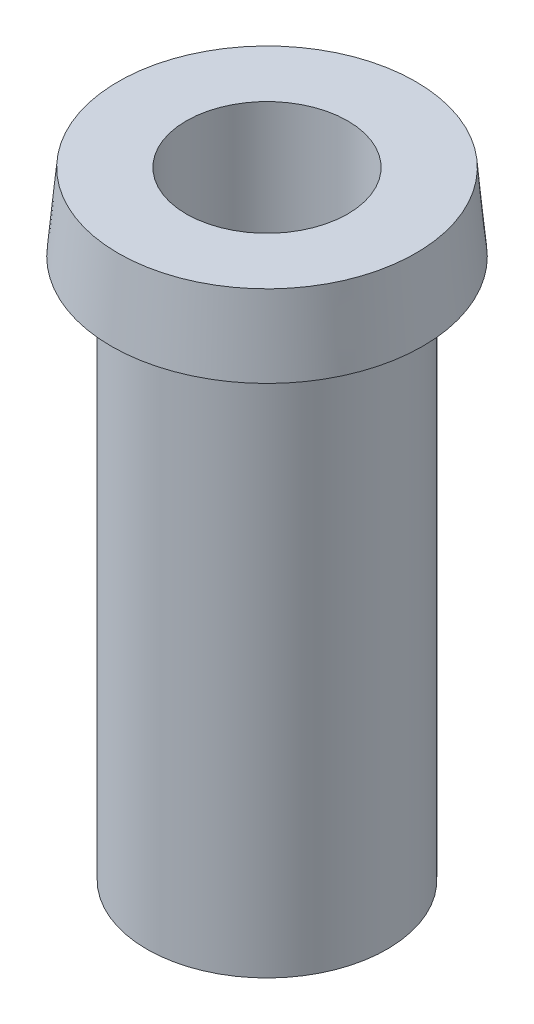
ISO-10303-21;
HEADER;
FILE_DESCRIPTION(('STEP AP214'),'2;1');
FILE_NAME('part.step','',(''),(''),'','','');
FILE_SCHEMA(('AUTOMOTIVE_DESIGN { 1 0 10303 214 1 1 1 1 }'));
ENDSEC;
DATA;
#1=APPLICATION_CONTEXT('core data for automotive mechanical design processes');
#2=APPLICATION_PROTOCOL_DEFINITION('international standard','automotive_design',2000,#1);
#3=PRODUCT_CONTEXT('',#1,'mechanical');
#4=PRODUCT('Part','Part','',(#3));
#5=PRODUCT_RELATED_PRODUCT_CATEGORY('part','',(#4));
#6=PRODUCT_DEFINITION_FORMATION('','',#4);
#7=PRODUCT_DEFINITION_CONTEXT('part definition',#1,'design');
#8=PRODUCT_DEFINITION('design','',#6,#7);
#9=PRODUCT_DEFINITION_SHAPE('','',#8);
#10=(LENGTH_UNIT() NAMED_UNIT(*) SI_UNIT(.MILLI.,.METRE.));
#11=(NAMED_UNIT(*) PLANE_ANGLE_UNIT() SI_UNIT($,.RADIAN.));
#12=(NAMED_UNIT(*) SI_UNIT($,.STERADIAN.) SOLID_ANGLE_UNIT());
#13=UNCERTAINTY_MEASURE_WITH_UNIT(LENGTH_MEASURE(1.E-05),#10,'distance_accuracy_value','');
#14=(GEOMETRIC_REPRESENTATION_CONTEXT(3) GLOBAL_UNCERTAINTY_ASSIGNED_CONTEXT((#13)) GLOBAL_UNIT_ASSIGNED_CONTEXT((#10,
#11,#12)) REPRESENTATION_CONTEXT('',''));
#15=CARTESIAN_POINT('',(0.,0.,0.));
#16=DIRECTION('',(0.,0.,1.));
#17=DIRECTION('',(1.,0.,0.));
#18=AXIS2_PLACEMENT_3D('',#15,#16,#17);
#19=CARTESIAN_POINT('',(0.,33.401,0.));
#20=DIRECTION('',(0.,-1.,0.));
#21=DIRECTION('',(0.,0.,-1.));
#22=AXIS2_PLACEMENT_3D('',#19,#20,#21);
#23=CYLINDRICAL_SURFACE('',#22,6.5024);
#24=CARTESIAN_POINT('',(0.,0.,0.));
#25=DIRECTION('',(0.,1.,0.));
#26=DIRECTION('',(0.,0.,1.));
#27=AXIS2_PLACEMENT_3D('',#24,#25,#26);
#28=CIRCLE('',#27,6.5024);
#29=CARTESIAN_POINT('',(0.,0.,6.5024));
#30=VERTEX_POINT('',#29);
#31=EDGE_CURVE('E45',#30,#30,#28,.T.);
#32=ORIENTED_EDGE('',*,*,#31,.T.);
#33=EDGE_LOOP('',(#32));
#34=FACE_BOUND('',#33,.T.);
#35=CARTESIAN_POINT('',(0.,29.2354,0.));
#36=DIRECTION('',(0.,1.,0.));
#37=DIRECTION('',(0.,0.,1.));
#38=AXIS2_PLACEMENT_3D('',#35,#36,#37);
#39=CIRCLE('',#38,6.5024);
#40=CARTESIAN_POINT('',(0.,29.2354,6.5024));
#41=VERTEX_POINT('',#40);
#42=EDGE_CURVE('E10',#41,#41,#39,.T.);
#43=ORIENTED_EDGE('',*,*,#42,.F.);
#44=EDGE_LOOP('',(#43));
#45=FACE_BOUND('',#44,.T.);
#46=ADVANCED_FACE('F38',(#34,#45),#23,.T.);
#47=CARTESIAN_POINT('',(0.,33.401,0.));
#48=DIRECTION('',(0.,1.,0.));
#49=DIRECTION('',(0.,0.,1.));
#50=AXIS2_PLACEMENT_3D('',#47,#48,#49);
#51=PLANE('',#50);
#52=CARTESIAN_POINT('',(0.,33.401,0.));
#53=DIRECTION('',(0.,1.,0.));
#54=DIRECTION('',(0.,0.,1.));
#55=AXIS2_PLACEMENT_3D('',#52,#53,#54);
#56=CIRCLE('',#55,4.3688);
#57=CARTESIAN_POINT('',(0.,33.401,4.3688));
#58=VERTEX_POINT('',#57);
#59=EDGE_CURVE('E51',#58,#58,#56,.T.);
#60=ORIENTED_EDGE('',*,*,#59,.F.);
#61=EDGE_LOOP('',(#60));
#62=FACE_BOUND('',#61,.T.);
#63=CARTESIAN_POINT('',(0.,33.401,0.));
#64=DIRECTION('',(0.,1.,0.));
#65=DIRECTION('',(0.,0.,1.));
#66=AXIS2_PLACEMENT_3D('',#63,#64,#65);
#67=CIRCLE('',#66,8.0518);
#68=CARTESIAN_POINT('',(0.,33.401,8.0518));
#69=VERTEX_POINT('',#68);
#70=EDGE_CURVE('E62',#69,#69,#67,.T.);
#71=ORIENTED_EDGE('',*,*,#70,.T.);
#72=EDGE_LOOP('',(#71));
#73=FACE_BOUND('',#72,.T.);
#74=ADVANCED_FACE('F85',(#62,#73),#51,.T.);
#75=CARTESIAN_POINT('',(0.,0.,0.));
#76=DIRECTION('',(0.,1.,0.));
#77=DIRECTION('',(0.,0.,1.));
#78=AXIS2_PLACEMENT_3D('',#75,#76,#77);
#79=PLANE('',#78);
#80=CARTESIAN_POINT('',(0.,0.,0.));
#81=DIRECTION('',(0.,1.,0.));
#82=DIRECTION('',(0.,0.,1.));
#83=AXIS2_PLACEMENT_3D('',#80,#81,#82);
#84=CIRCLE('',#83,4.3688);
#85=CARTESIAN_POINT('',(0.,0.,4.3688));
#86=VERTEX_POINT('',#85);
#87=EDGE_CURVE('E57',#86,#86,#84,.T.);
#88=ORIENTED_EDGE('',*,*,#87,.T.);
#89=EDGE_LOOP('',(#88));
#90=FACE_BOUND('',#89,.T.);
#91=ORIENTED_EDGE('',*,*,#31,.F.);
#92=EDGE_LOOP('',(#91));
#93=FACE_BOUND('',#92,.T.);
#94=ADVANCED_FACE('F89',(#90,#93),#79,.F.);
#95=CARTESIAN_POINT('',(0.,33.401,0.));
#96=DIRECTION('',(0.,-1.,0.));
#97=DIRECTION('',(0.,0.,-1.));
#98=AXIS2_PLACEMENT_3D('',#95,#96,#97);
#99=CYLINDRICAL_SURFACE('',#98,4.3688);
#100=ORIENTED_EDGE('',*,*,#59,.T.);
#101=EDGE_LOOP('',(#100));
#102=FACE_BOUND('',#101,.T.);
#103=ORIENTED_EDGE('',*,*,#87,.F.);
#104=EDGE_LOOP('',(#103));
#105=FACE_BOUND('',#104,.T.);
#106=ADVANCED_FACE('F81',(#102,#105),#99,.F.);
#107=CARTESIAN_POINT('',(0.,29.2354,0.));
#108=DIRECTION('',(0.,-1.,0.));
#109=DIRECTION('',(0.,0.,-1.));
#110=AXIS2_PLACEMENT_3D('',#107,#108,#109);
#111=CONICAL_SURFACE('',#110,8.4328,0.0912096397566868);
#112=ORIENTED_EDGE('',*,*,#70,.F.);
#113=EDGE_LOOP('',(#112));
#114=FACE_BOUND('',#113,.T.);
#115=CARTESIAN_POINT('',(0.,29.2354,0.));
#116=DIRECTION('',(0.,1.,0.));
#117=DIRECTION('',(0.,0.,1.));
#118=AXIS2_PLACEMENT_3D('',#115,#116,#117);
#119=CIRCLE('',#118,8.4328);
#120=CARTESIAN_POINT('',(0.,29.2354,8.4328));
#121=VERTEX_POINT('',#120);
#122=EDGE_CURVE('E67',#121,#121,#119,.T.);
#123=ORIENTED_EDGE('',*,*,#122,.T.);
#124=EDGE_LOOP('',(#123));
#125=FACE_BOUND('',#124,.T.);
#126=ADVANCED_FACE('F73',(#114,#125),#111,.T.);
#127=CARTESIAN_POINT('',(8.4328,29.2354,0.));
#128=DIRECTION('',(0.,1.,0.));
#129=DIRECTION('',(0.,0.,1.));
#130=AXIS2_PLACEMENT_3D('',#127,#128,#129);
#131=PLANE('',#130);
#132=ORIENTED_EDGE('',*,*,#122,.F.);
#133=EDGE_LOOP('',(#132));
#134=FACE_BOUND('',#133,.T.);
#135=ORIENTED_EDGE('',*,*,#42,.T.);
#136=EDGE_LOOP('',(#135));
#137=FACE_BOUND('',#136,.T.);
#138=ADVANCED_FACE('F75',(#134,#137),#131,.F.);
#139=CLOSED_SHELL('',(#46,#74,#94,#106,#126,#138));
#140=MANIFOLD_SOLID_BREP('B2',#139);
#141=ADVANCED_BREP_SHAPE_REPRESENTATION('',(#18,#140),#14);
#142=SHAPE_DEFINITION_REPRESENTATION(#9,#141);
ENDSEC;
END-ISO-10303-21;
